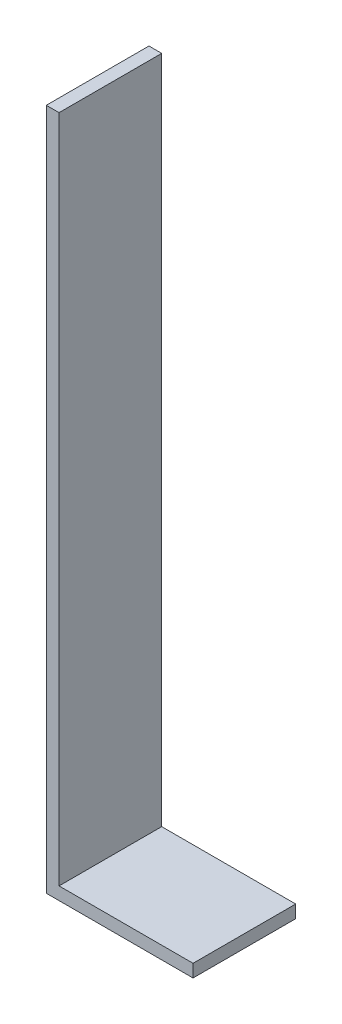
ISO-10303-21;
HEADER;
FILE_DESCRIPTION(('STEP AP214'),'2;1');
FILE_NAME('part.step','',(''),(''),'','','');
FILE_SCHEMA(('AUTOMOTIVE_DESIGN { 1 0 10303 214 1 1 1 1 }'));
ENDSEC;
DATA;
#1=APPLICATION_CONTEXT('core data for automotive mechanical design processes');
#2=APPLICATION_PROTOCOL_DEFINITION('international standard','automotive_design',2000,#1);
#3=PRODUCT_CONTEXT('',#1,'mechanical');
#4=PRODUCT('Part','Part','',(#3));
#5=PRODUCT_RELATED_PRODUCT_CATEGORY('part','',(#4));
#6=PRODUCT_DEFINITION_FORMATION('','',#4);
#7=PRODUCT_DEFINITION_CONTEXT('part definition',#1,'design');
#8=PRODUCT_DEFINITION('design','',#6,#7);
#9=PRODUCT_DEFINITION_SHAPE('','',#8);
#10=(LENGTH_UNIT() NAMED_UNIT(*) SI_UNIT(.MILLI.,.METRE.));
#11=(NAMED_UNIT(*) PLANE_ANGLE_UNIT() SI_UNIT($,.RADIAN.));
#12=(NAMED_UNIT(*) SI_UNIT($,.STERADIAN.) SOLID_ANGLE_UNIT());
#13=UNCERTAINTY_MEASURE_WITH_UNIT(LENGTH_MEASURE(1.E-05),#10,'distance_accuracy_value','');
#14=(GEOMETRIC_REPRESENTATION_CONTEXT(3) GLOBAL_UNCERTAINTY_ASSIGNED_CONTEXT((#13)) GLOBAL_UNIT_ASSIGNED_CONTEXT((#10,
#11,#12)) REPRESENTATION_CONTEXT('',''));
#15=CARTESIAN_POINT('',(0.,0.,0.));
#16=DIRECTION('',(0.,0.,1.));
#17=DIRECTION('',(1.,0.,0.));
#18=AXIS2_PLACEMENT_3D('',#15,#16,#17);
#19=CARTESIAN_POINT('',(0.,0.,50.8));
#20=DIRECTION('',(1.,0.,0.));
#21=DIRECTION('',(0.,0.,-1.));
#22=AXIS2_PLACEMENT_3D('',#19,#20,#21);
#23=PLANE('',#22);
#24=DIRECTION('',(0.,-1.,0.));
#25=VECTOR('',#24,1.);
#26=CARTESIAN_POINT('',(0.,0.,0.));
#27=LINE('',#26,#25);
#28=CARTESIAN_POINT('',(0.,337.71,0.));
#29=VERTEX_POINT('',#28);
#30=CARTESIAN_POINT('',(0.,0.,0.));
#31=VERTEX_POINT('',#30);
#32=EDGE_CURVE('E117',#29,#31,#27,.T.);
#33=ORIENTED_EDGE('',*,*,#32,.T.);
#34=DIRECTION('',(0.,0.,-1.));
#35=VECTOR('',#34,1.);
#36=CARTESIAN_POINT('',(0.,0.,50.8));
#37=LINE('',#36,#35);
#38=CARTESIAN_POINT('',(0.,0.,50.8));
#39=VERTEX_POINT('',#38);
#40=EDGE_CURVE('E11',#39,#31,#37,.T.);
#41=ORIENTED_EDGE('',*,*,#40,.F.);
#42=DIRECTION('',(0.,-1.,0.));
#43=VECTOR('',#42,1.);
#44=CARTESIAN_POINT('',(0.,0.,50.8));
#45=LINE('',#44,#43);
#46=CARTESIAN_POINT('',(0.,337.71,50.8));
#47=VERTEX_POINT('',#46);
#48=EDGE_CURVE('E127',#47,#39,#45,.T.);
#49=ORIENTED_EDGE('',*,*,#48,.F.);
#50=DIRECTION('',(0.,0.,-1.));
#51=VECTOR('',#50,1.);
#52=CARTESIAN_POINT('',(0.,337.71,50.8));
#53=LINE('',#52,#51);
#54=EDGE_CURVE('E113',#47,#29,#53,.T.);
#55=ORIENTED_EDGE('',*,*,#54,.T.);
#56=EDGE_LOOP('',(#33,#41,#49,#55));
#57=FACE_BOUND('',#56,.T.);
#58=ADVANCED_FACE('F33',(#57),#23,.F.);
#59=CARTESIAN_POINT('',(0.,0.,50.8));
#60=DIRECTION('',(0.,1.,0.));
#61=DIRECTION('',(0.,0.,1.));
#62=AXIS2_PLACEMENT_3D('',#59,#60,#61);
#63=PLANE('',#62);
#64=DIRECTION('',(1.,0.,0.));
#65=VECTOR('',#64,1.);
#66=CARTESIAN_POINT('',(0.,0.,0.));
#67=LINE('',#66,#65);
#68=CARTESIAN_POINT('',(72.62,0.,0.));
#69=VERTEX_POINT('',#68);
#70=EDGE_CURVE('E120',#31,#69,#67,.T.);
#71=ORIENTED_EDGE('',*,*,#70,.T.);
#72=DIRECTION('',(0.,0.,-1.));
#73=VECTOR('',#72,1.);
#74=CARTESIAN_POINT('',(72.62,0.,50.8));
#75=LINE('',#74,#73);
#76=CARTESIAN_POINT('',(72.62,0.,50.8));
#77=VERTEX_POINT('',#76);
#78=EDGE_CURVE('E41',#77,#69,#75,.T.);
#79=ORIENTED_EDGE('',*,*,#78,.F.);
#80=DIRECTION('',(1.,0.,0.));
#81=VECTOR('',#80,1.);
#82=CARTESIAN_POINT('',(0.,0.,50.8));
#83=LINE('',#82,#81);
#84=EDGE_CURVE('E86',#39,#77,#83,.T.);
#85=ORIENTED_EDGE('',*,*,#84,.F.);
#86=ORIENTED_EDGE('',*,*,#40,.T.);
#87=EDGE_LOOP('',(#71,#79,#85,#86));
#88=FACE_BOUND('',#87,.T.);
#89=ADVANCED_FACE('F151',(#88),#63,.F.);
#90=CARTESIAN_POINT('',(72.62,6.31,50.8));
#91=DIRECTION('',(-1.,0.,0.));
#92=DIRECTION('',(0.,0.,1.));
#93=AXIS2_PLACEMENT_3D('',#90,#91,#92);
#94=PLANE('',#93);
#95=DIRECTION('',(0.,1.,0.));
#96=VECTOR('',#95,1.);
#97=CARTESIAN_POINT('',(72.62,6.31,0.));
#98=LINE('',#97,#96);
#99=CARTESIAN_POINT('',(72.62,6.31,0.));
#100=VERTEX_POINT('',#99);
#101=EDGE_CURVE('E122',#69,#100,#98,.T.);
#102=ORIENTED_EDGE('',*,*,#101,.T.);
#103=DIRECTION('',(0.,0.,-1.));
#104=VECTOR('',#103,1.);
#105=CARTESIAN_POINT('',(72.62,6.31,50.8));
#106=LINE('',#105,#104);
#107=CARTESIAN_POINT('',(72.62,6.31,50.8));
#108=VERTEX_POINT('',#107);
#109=EDGE_CURVE('E108',#108,#100,#106,.T.);
#110=ORIENTED_EDGE('',*,*,#109,.F.);
#111=DIRECTION('',(0.,1.,0.));
#112=VECTOR('',#111,1.);
#113=CARTESIAN_POINT('',(72.62,6.31,50.8));
#114=LINE('',#113,#112);
#115=EDGE_CURVE('E99',#77,#108,#114,.T.);
#116=ORIENTED_EDGE('',*,*,#115,.F.);
#117=ORIENTED_EDGE('',*,*,#78,.T.);
#118=EDGE_LOOP('',(#102,#110,#116,#117));
#119=FACE_BOUND('',#118,.T.);
#120=ADVANCED_FACE('F133',(#119),#94,.F.);
#121=CARTESIAN_POINT('',(6.31,6.31,50.8));
#122=DIRECTION('',(0.,-1.,0.));
#123=DIRECTION('',(0.,0.,-1.));
#124=AXIS2_PLACEMENT_3D('',#121,#122,#123);
#125=PLANE('',#124);
#126=DIRECTION('',(-1.,0.,0.));
#127=VECTOR('',#126,1.);
#128=CARTESIAN_POINT('',(6.31,6.31,0.));
#129=LINE('',#128,#127);
#130=CARTESIAN_POINT('',(6.31,6.31,0.));
#131=VERTEX_POINT('',#130);
#132=EDGE_CURVE('E107',#100,#131,#129,.T.);
#133=ORIENTED_EDGE('',*,*,#132,.T.);
#134=DIRECTION('',(0.,0.,-1.));
#135=VECTOR('',#134,1.);
#136=CARTESIAN_POINT('',(6.31,6.31,50.8));
#137=LINE('',#136,#135);
#138=CARTESIAN_POINT('',(6.31,6.31,50.8));
#139=VERTEX_POINT('',#138);
#140=EDGE_CURVE('E104',#139,#131,#137,.T.);
#141=ORIENTED_EDGE('',*,*,#140,.F.);
#142=DIRECTION('',(-1.,0.,0.));
#143=VECTOR('',#142,1.);
#144=CARTESIAN_POINT('',(6.31,6.31,50.8));
#145=LINE('',#144,#143);
#146=EDGE_CURVE('E93',#108,#139,#145,.T.);
#147=ORIENTED_EDGE('',*,*,#146,.F.);
#148=ORIENTED_EDGE('',*,*,#109,.T.);
#149=EDGE_LOOP('',(#133,#141,#147,#148));
#150=FACE_BOUND('',#149,.T.);
#151=ADVANCED_FACE('F105',(#150),#125,.F.);
#152=CARTESIAN_POINT('',(6.31,6.31,50.8));
#153=DIRECTION('',(-1.,0.,0.));
#154=DIRECTION('',(0.,0.,1.));
#155=AXIS2_PLACEMENT_3D('',#152,#153,#154);
#156=PLANE('',#155);
#157=DIRECTION('',(0.,1.,0.));
#158=VECTOR('',#157,1.);
#159=CARTESIAN_POINT('',(6.31,6.31,0.));
#160=LINE('',#159,#158);
#161=CARTESIAN_POINT('',(6.31,337.71,0.));
#162=VERTEX_POINT('',#161);
#163=EDGE_CURVE('E72',#131,#162,#160,.T.);
#164=ORIENTED_EDGE('',*,*,#163,.T.);
#165=DIRECTION('',(0.,0.,-1.));
#166=VECTOR('',#165,1.);
#167=CARTESIAN_POINT('',(6.31,337.71,50.8));
#168=LINE('',#167,#166);
#169=CARTESIAN_POINT('',(6.31,337.71,50.8));
#170=VERTEX_POINT('',#169);
#171=EDGE_CURVE('E109',#170,#162,#168,.T.);
#172=ORIENTED_EDGE('',*,*,#171,.F.);
#173=DIRECTION('',(0.,1.,0.));
#174=VECTOR('',#173,1.);
#175=CARTESIAN_POINT('',(6.31,6.31,50.8));
#176=LINE('',#175,#174);
#177=EDGE_CURVE('E97',#139,#170,#176,.T.);
#178=ORIENTED_EDGE('',*,*,#177,.F.);
#179=ORIENTED_EDGE('',*,*,#140,.T.);
#180=EDGE_LOOP('',(#164,#172,#178,#179));
#181=FACE_BOUND('',#180,.T.);
#182=ADVANCED_FACE('F111',(#181),#156,.F.);
#183=CARTESIAN_POINT('',(6.31,337.71,50.8));
#184=DIRECTION('',(0.,-1.,0.));
#185=DIRECTION('',(0.,0.,-1.));
#186=AXIS2_PLACEMENT_3D('',#183,#184,#185);
#187=PLANE('',#186);
#188=DIRECTION('',(-1.,0.,0.));
#189=VECTOR('',#188,1.);
#190=CARTESIAN_POINT('',(6.31,337.71,0.));
#191=LINE('',#190,#189);
#192=EDGE_CURVE('E78',#162,#29,#191,.T.);
#193=ORIENTED_EDGE('',*,*,#192,.T.);
#194=ORIENTED_EDGE('',*,*,#54,.F.);
#195=DIRECTION('',(-1.,0.,0.));
#196=VECTOR('',#195,1.);
#197=CARTESIAN_POINT('',(6.31,337.71,50.8));
#198=LINE('',#197,#196);
#199=EDGE_CURVE('E49',#170,#47,#198,.T.);
#200=ORIENTED_EDGE('',*,*,#199,.F.);
#201=ORIENTED_EDGE('',*,*,#171,.T.);
#202=EDGE_LOOP('',(#193,#194,#200,#201));
#203=FACE_BOUND('',#202,.T.);
#204=ADVANCED_FACE('F140',(#203),#187,.F.);
#205=CARTESIAN_POINT('',(0.,0.,50.8));
#206=DIRECTION('',(0.,0.,1.));
#207=DIRECTION('',(1.,0.,0.));
#208=AXIS2_PLACEMENT_3D('',#205,#206,#207);
#209=PLANE('',#208);
#210=ORIENTED_EDGE('',*,*,#48,.T.);
#211=ORIENTED_EDGE('',*,*,#84,.T.);
#212=ORIENTED_EDGE('',*,*,#115,.T.);
#213=ORIENTED_EDGE('',*,*,#146,.T.);
#214=ORIENTED_EDGE('',*,*,#177,.T.);
#215=ORIENTED_EDGE('',*,*,#199,.T.);
#216=EDGE_LOOP('',(#210,#211,#212,#213,#214,#215));
#217=FACE_BOUND('',#216,.T.);
#218=ADVANCED_FACE('F95',(#217),#209,.T.);
#219=CARTESIAN_POINT('',(0.,0.,0.));
#220=DIRECTION('',(0.,0.,1.));
#221=DIRECTION('',(1.,0.,0.));
#222=AXIS2_PLACEMENT_3D('',#219,#220,#221);
#223=PLANE('',#222);
#224=ORIENTED_EDGE('',*,*,#32,.F.);
#225=ORIENTED_EDGE('',*,*,#192,.F.);
#226=ORIENTED_EDGE('',*,*,#163,.F.);
#227=ORIENTED_EDGE('',*,*,#132,.F.);
#228=ORIENTED_EDGE('',*,*,#101,.F.);
#229=ORIENTED_EDGE('',*,*,#70,.F.);
#230=EDGE_LOOP('',(#224,#225,#226,#227,#228,#229));
#231=FACE_BOUND('',#230,.T.);
#232=ADVANCED_FACE('F136',(#231),#223,.F.);
#233=CLOSED_SHELL('',(#58,#89,#120,#151,#182,#204,#218,#232));
#234=MANIFOLD_SOLID_BREP('B2',#233);
#235=ADVANCED_BREP_SHAPE_REPRESENTATION('',(#18,#234),#14);
#236=SHAPE_DEFINITION_REPRESENTATION(#9,#235);
ENDSEC;
END-ISO-10303-21;
